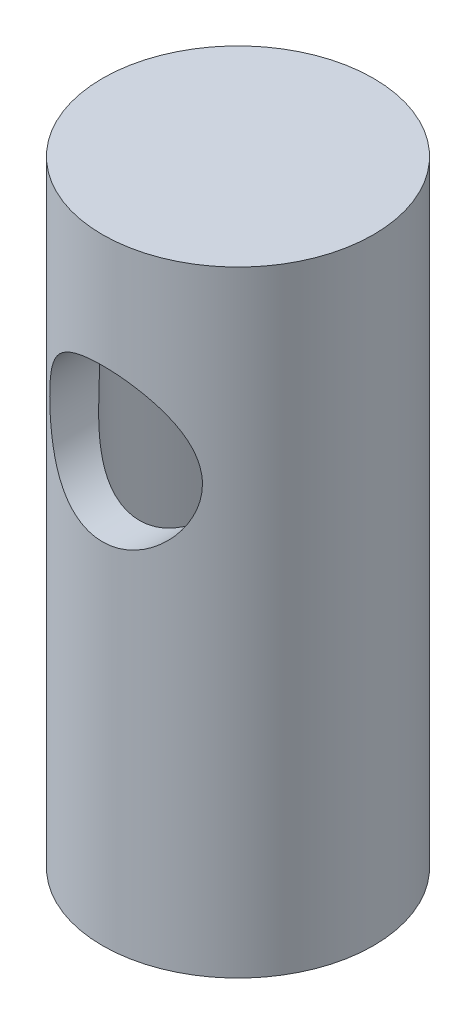
ISO-10303-21;
HEADER;
FILE_DESCRIPTION(('STEP AP214'),'2;1');
FILE_NAME('part.step','',(''),(''),'','','');
FILE_SCHEMA(('AUTOMOTIVE_DESIGN { 1 0 10303 214 1 1 1 1 }'));
ENDSEC;
DATA;
#1=APPLICATION_CONTEXT('core data for automotive mechanical design processes');
#2=APPLICATION_PROTOCOL_DEFINITION('international standard','automotive_design',2000,#1);
#3=PRODUCT_CONTEXT('',#1,'mechanical');
#4=PRODUCT('Part','Part','',(#3));
#5=PRODUCT_RELATED_PRODUCT_CATEGORY('part','',(#4));
#6=PRODUCT_DEFINITION_FORMATION('','',#4);
#7=PRODUCT_DEFINITION_CONTEXT('part definition',#1,'design');
#8=PRODUCT_DEFINITION('design','',#6,#7);
#9=PRODUCT_DEFINITION_SHAPE('','',#8);
#10=(LENGTH_UNIT() NAMED_UNIT(*) SI_UNIT(.MILLI.,.METRE.));
#11=(NAMED_UNIT(*) PLANE_ANGLE_UNIT() SI_UNIT($,.RADIAN.));
#12=(NAMED_UNIT(*) SI_UNIT($,.STERADIAN.) SOLID_ANGLE_UNIT());
#13=UNCERTAINTY_MEASURE_WITH_UNIT(LENGTH_MEASURE(1.E-05),#10,'distance_accuracy_value','');
#14=(GEOMETRIC_REPRESENTATION_CONTEXT(3) GLOBAL_UNCERTAINTY_ASSIGNED_CONTEXT((#13)) GLOBAL_UNIT_ASSIGNED_CONTEXT((#10,
#11,#12)) REPRESENTATION_CONTEXT('',''));
#15=CARTESIAN_POINT('',(0.,0.,0.));
#16=DIRECTION('',(0.,0.,1.));
#17=DIRECTION('',(1.,0.,0.));
#18=AXIS2_PLACEMENT_3D('',#15,#16,#17);
#19=CARTESIAN_POINT('',(3.53883589099269E-13,17.3000000000001,-5.5));
#20=DIRECTION('',(0.,0.,1.));
#21=DIRECTION('',(1.,0.,0.));
#22=AXIS2_PLACEMENT_3D('',#19,#20,#21);
#23=CYLINDRICAL_SURFACE('',#22,3.1);
#24=CARTESIAN_POINT('',(3.10000000000035,17.3000000000001,-2.52784493195277));
#25=CARTESIAN_POINT('',(3.09999961919371,17.3712555712001,-2.52784574093311));
#26=CARTESIAN_POINT('',(3.09753439791373,17.4425153113779,-2.53087865516682));
#27=CARTESIAN_POINT('',(3.08776425877487,17.5841936421896,-2.54278674023389));
#28=CARTESIAN_POINT('',(3.08045864827326,17.6546121109722,-2.55166274719215));
#29=CARTESIAN_POINT('',(3.05151757485534,17.8639778219894,-2.58634576054116));
#30=CARTESIAN_POINT('',(3.02285944185724,18.0006757075071,-2.62020347776882));
#31=CARTESIAN_POINT('',(2.94130207894668,18.2933519056116,-2.71167067274079));
#32=CARTESIAN_POINT('',(2.88447849264723,18.4470309211889,-2.77285031642847));
#33=CARTESIAN_POINT('',(2.75011335563942,18.739738251803,-2.90617907189162));
#34=CARTESIAN_POINT('',(2.67254674573882,18.8787485607272,-2.97834140587626));
#35=CARTESIAN_POINT('',(2.49592691468387,19.1457072154897,-3.12795783572872));
#36=CARTESIAN_POINT('',(2.3963536235693,19.273259321814,-3.2055019160276));
#37=CARTESIAN_POINT('',(2.17772837866821,19.5121646581724,-3.35786412946302));
#38=CARTESIAN_POINT('',(2.05869095152856,19.6235298527665,-3.4326842450413));
#39=CARTESIAN_POINT('',(1.80728422149956,19.8235610318894,-3.57119162579643));
#40=CARTESIAN_POINT('',(1.67573700604735,19.9130128953005,-3.635224841056));
#41=CARTESIAN_POINT('',(1.39643160562404,20.0723171931872,-3.75136978376732));
#42=CARTESIAN_POINT('',(1.24868898673577,20.1421882217937,-3.80349281248995));
#43=CARTESIAN_POINT('',(0.96323655310288,20.2498766896615,-3.88467854744163));
#44=CARTESIAN_POINT('',(0.827419124070257,20.2909531899676,-3.91604298335587));
#45=CARTESIAN_POINT('',(0.549029124361982,20.3543251551191,-3.9646543384196));
#46=CARTESIAN_POINT('',(0.406460979987843,20.3766327510472,-3.98191037617887));
#47=CARTESIAN_POINT('',(0.118129121638677,20.4011342698101,-4.00087142946686));
#48=CARTESIAN_POINT('',(-0.0276427199802487,20.4032691661889,-4.00253080821742));
#49=CARTESIAN_POINT('',(-0.317364296176167,20.387124210706,-3.99002636463383));
#50=CARTESIAN_POINT('',(-0.461313770984674,20.368841480834,-3.97586031159191));
#51=CARTESIAN_POINT('',(-0.73686754395094,20.3142826506517,-3.93390568713725));
#52=CARTESIAN_POINT('',(-0.868736309815778,20.2788356258629,-3.90674542775094));
#53=CARTESIAN_POINT('',(-1.12412799855287,20.1921516724821,-3.84106018790414));
#54=CARTESIAN_POINT('',(-1.247648970535,20.1409110683624,-3.8025325620863));
#55=CARTESIAN_POINT('',(-1.496908178085,20.0185490905798,-3.71195871888118));
#56=CARTESIAN_POINT('',(-1.62153590072253,19.9459123341516,-3.65892208872868));
#57=CARTESIAN_POINT('',(-1.85722616418577,19.7861646857189,-3.54511945328042));
#58=CARTESIAN_POINT('',(-1.968278877243,19.6990434139326,-3.48434791242756));
#59=CARTESIAN_POINT('',(-2.19738156573586,19.4931333063421,-3.34557701732754));
#60=CARTESIAN_POINT('',(-2.31227714037555,19.3715059872555,-3.26658445312791));
#61=CARTESIAN_POINT('',(-2.5211768027675,19.1114983960333,-3.10818793012157));
#62=CARTESIAN_POINT('',(-2.61516330503679,18.9731041721151,-3.02878368206824));
#63=CARTESIAN_POINT('',(-2.76762533135622,18.7036352058329,-2.88948574724767));
#64=CARTESIAN_POINT('',(-2.82938377606428,18.5749827723254,-2.82851128916844));
#65=CARTESIAN_POINT('',(-2.9357068780092,18.3061858130971,-2.71799479675345));
#66=CARTESIAN_POINT('',(-2.98030995883409,18.1660678317236,-2.66842731502265));
#67=CARTESIAN_POINT('',(-3.04130155928687,17.9109309347035,-2.59848268697316));
#68=CARTESIAN_POINT('',(-3.06191407444093,17.7980974841371,-2.5739379328752));
#69=CARTESIAN_POINT('',(-3.09048502463603,17.5687046365382,-2.53957213723589));
#70=CARTESIAN_POINT('',(-3.09846538450437,17.4521520541646,-2.52972558665546));
#71=CARTESIAN_POINT('',(-3.10113404168222,17.2183251079746,-2.52645548046137));
#72=CARTESIAN_POINT('',(-3.09578541203111,17.1010496388549,-2.53307754981358));
#73=CARTESIAN_POINT('',(-3.07219543043933,16.8696551460248,-2.56162678367886));
#74=CARTESIAN_POINT('',(-3.05393438623813,16.7555412204504,-2.58357732445827));
#75=CARTESIAN_POINT('',(-2.99796045084913,16.4968903867693,-2.64850587674715));
#76=CARTESIAN_POINT('',(-2.95586295343442,16.3544709692538,-2.69599177574273));
#77=CARTESIAN_POINT('',(-2.85402988216378,16.0810092521586,-2.80356685356465));
#78=CARTESIAN_POINT('',(-2.79424140331063,15.9500026258508,-2.86369367675896));
#79=CARTESIAN_POINT('',(-2.68074488498459,15.7402432217302,-2.96943572156276));
#80=CARTESIAN_POINT('',(-2.63132910245084,15.658298736066,-3.01345133300174));
#81=CARTESIAN_POINT('',(-2.52550207156438,15.4997407398975,-3.10268243369515));
#82=CARTESIAN_POINT('',(-2.46908839965332,15.4231290907197,-3.14789833435701));
#83=CARTESIAN_POINT('',(-2.28966790336391,15.2015404417918,-3.28325659106933));
#84=CARTESIAN_POINT('',(-2.15633898902273,15.0645477380677,-3.37324996195023));
#85=CARTESIAN_POINT('',(-1.88786210712003,14.835932955663,-3.52930091170506));
#86=CARTESIAN_POINT('',(-1.75675321128694,14.7405547302821,-3.59684370367943));
#87=CARTESIAN_POINT('',(-1.47724527932951,14.569714269087,-3.72034524430613));
#88=CARTESIAN_POINT('',(-1.32887419570484,14.4942204643073,-3.77632232411431));
#89=CARTESIAN_POINT('',(-1.0428294830555,14.3772740121066,-3.8640783637407));
#90=CARTESIAN_POINT('',(-0.907367136065546,14.3322752359359,-3.89831638948326));
#91=CARTESIAN_POINT('',(-0.628859216424906,14.2610610777622,-3.95279873177774));
#92=CARTESIAN_POINT('',(-0.485817837103067,14.2348354231416,-3.97305070125979));
#93=CARTESIAN_POINT('',(-0.195574842092821,14.2027215375749,-3.99787799003022));
#94=CARTESIAN_POINT('',(-0.0483603882720157,14.1969050009991,-4.00239804486007));
#95=CARTESIAN_POINT('',(0.244999864279834,14.2062140967541,-3.99518489730406));
#96=CARTESIAN_POINT('',(0.3911456308627,14.2213403565006,-3.98345120797965));
#97=CARTESIAN_POINT('',(0.669786686992614,14.2701012818615,-3.94589200602359));
#98=CARTESIAN_POINT('',(0.802588404312789,14.3026543907056,-3.92089064036331));
#99=CARTESIAN_POINT('',(1.06027503531116,14.3838238317389,-3.85919546547971));
#100=CARTESIAN_POINT('',(1.1851580770931,14.4324439452607,-3.82249890389134));
#101=CARTESIAN_POINT('',(1.43610658497467,14.5489154922742,-3.73588114945531));
#102=CARTESIAN_POINT('',(1.56122234819681,14.6181253824997,-3.68505345230524));
#103=CARTESIAN_POINT('',(1.79836128263859,14.7710015751779,-3.57533206525064));
#104=CARTESIAN_POINT('',(1.91037626028614,14.8546768444507,-3.51643337701191));
#105=CARTESIAN_POINT('',(2.14160046570904,15.0525364724897,-3.38154189124019));
#106=CARTESIAN_POINT('',(2.2578208459493,15.1694796537634,-3.30447720482253));
#107=CARTESIAN_POINT('',(2.47014450840322,15.4197419067186,-3.1489206275693));
#108=CARTESIAN_POINT('',(2.56622846239247,15.5530765189794,-3.07042744338394));
#109=CARTESIAN_POINT('',(2.72790479829606,15.8200857501056,-2.92726465663872));
#110=CARTESIAN_POINT('',(2.795684491068,15.952122688412,-2.86202272267527));
#111=CARTESIAN_POINT('',(2.91291319314547,16.2288046413986,-2.74261040904916));
#112=CARTESIAN_POINT('',(2.96239020668408,16.3734299726596,-2.68842317247582));
#113=CARTESIAN_POINT('',(3.03325535723146,16.6476321582904,-2.60802030600147));
#114=CARTESIAN_POINT('',(3.05807821971029,16.7752964952995,-2.57854049835101));
#115=CARTESIAN_POINT('',(3.08311910440419,16.9703242508766,-2.54843696280628));
#116=CARTESIAN_POINT('',(3.08943363954387,17.0358677357431,-2.54075566813512));
#117=CARTESIAN_POINT('',(3.09787331229765,17.1676064876364,-2.53046042834751));
#118=CARTESIAN_POINT('',(3.10000035378111,17.2338014447031,-2.52784418038586));
#119=CARTESIAN_POINT('',(3.10000000000035,17.3000000000001,-2.52784493195277));
#120=B_SPLINE_CURVE_WITH_KNOTS('',3,(#24,#25,#26,#27,#28,#29,#30,#31,#32,#33,#34,#35,#36,#37,
#38,#39,#40,#41,#42,#43,#44,#45,#46,#47,#48,#49,#50,#51,#52,#53,#54,#55,#56,#57,#58,#59,#60,#61,
#62,#63,#64,#65,#66,#67,#68,#69,#70,#71,#72,#73,#74,#75,#76,#77,#78,#79,#80,#81,#82,#83,#84,#85,
#86,#87,#88,#89,#90,#91,#92,#93,#94,#95,#96,#97,#98,#99,#100,#101,#102,#103,#104,#105,#106,#107,
#108,#109,#110,#111,#112,#113,#114,#115,#116,#117,#118,#119),.UNSPECIFIED.,.T.,.F.,(4,2,2,2,2,2,
2,2,2,2,2,2,2,2,2,2,2,2,2,2,2,2,2,2,2,2,2,2,2,2,2,2,2,2,2,2,2,2,2,2,2,2,2,2,2,2,2,4),(0.,
0.21366508663548,0.427360754600619,0.855809914955401,1.37772471555355,1.90027290084145,
2.43682357490332,2.97297561829987,3.48542384746284,3.9973837895288,4.43146821760399,
4.86527186379727,5.30034445222658,5.73547837498644,6.15142263765094,6.56746377325984,
7.02686356687362,7.48659400234934,8.03963129362027,8.59313197065748,9.05731973209165,
9.52046169300837,9.87094487688248,10.2208190797803,10.571663659771,10.9230444574905,
11.3882347864584,11.8548305776667,12.1704500007607,12.4861790381846,13.1166595534028,
13.6416204586391,14.1657428304335,14.6042540779241,15.0425251890581,15.4823343522429,
15.9221566917562,16.3374001437266,16.7527413919709,17.2063221476341,17.6601850844362,
18.2041795460807,18.7486938005938,19.233551780756,19.7176647992549,20.1154884025408,
20.3140799656732,20.5125812170768),.UNSPECIFIED.);
#121=CARTESIAN_POINT('',(3.10000000000035,17.3000000000001,-2.52784493195277));
#122=VERTEX_POINT('',#121);
#123=EDGE_CURVE('E36',#122,#122,#120,.T.);
#124=ORIENTED_EDGE('',*,*,#123,.T.);
#125=EDGE_LOOP('',(#124));
#126=FACE_BOUND('',#125,.T.);
#127=CARTESIAN_POINT('',(2.88652296454992E-13,20.4000000000001,-5.5));
#128=CARTESIAN_POINT('',(-0.080262632435428,20.3999998034787,-5.49999990682888));
#129=CARTESIAN_POINT('',(-0.160521827303716,20.3968773730526,-5.49823772074624));
#130=CARTESIAN_POINT('',(-0.320415396259867,20.3844412076063,-5.49124358635375));
#131=CARTESIAN_POINT('',(-0.400049542149584,20.3751253089282,-5.48601042547741));
#132=CARTESIAN_POINT('',(-0.637021736450279,20.338039973795,-5.46527467257751));
#133=CARTESIAN_POINT('',(-0.792605200536478,20.3011325569167,-5.44473540973389));
#134=CARTESIAN_POINT('',(-1.09381878140616,20.2049155626083,-5.39230312589284));
#135=CARTESIAN_POINT('',(-1.23948334567826,20.1456887348582,-5.36045206842486));
#136=CARTESIAN_POINT('',(-1.51854595874315,20.0070830378088,-5.28817574751319));
#137=CARTESIAN_POINT('',(-1.65194095708642,19.927699175433,-5.24774836004519));
#138=CARTESIAN_POINT('',(-1.91323389681138,19.7447410046295,-5.15848143213593));
#139=CARTESIAN_POINT('',(-2.0400738770545,19.6398518777834,-5.10924894725752));
#140=CARTESIAN_POINT('',(-2.27538176991611,19.4117593603085,-5.0088952804327));
#141=CARTESIAN_POINT('',(-2.38383020956816,19.2885368141301,-4.95777216556694));
#142=CARTESIAN_POINT('',(-2.59078954450882,19.0119303210229,-4.8531039174898));
#143=CARTESIAN_POINT('',(-2.68705917147908,18.8567376703794,-4.79986865939255));
#144=CARTESIAN_POINT('',(-2.85172159074769,18.5292824284682,-4.70391519171295));
#145=CARTESIAN_POINT('',(-2.92015536842132,18.3570454015948,-4.66118155658493));
#146=CARTESIAN_POINT('',(-3.01429495596228,18.0384792613907,-4.60070147472893));
#147=CARTESIAN_POINT('',(-3.04603434612334,17.894579580445,-4.57955297142091));
#148=CARTESIAN_POINT('',(-3.08872992519048,17.6024529917743,-4.55087238950658));
#149=CARTESIAN_POINT('',(-3.09970747390032,17.4542306908056,-4.54332631708091));
#150=CARTESIAN_POINT('',(-3.10028134149946,17.1575478349604,-4.54293466795083));
#151=CARTESIAN_POINT('',(-3.08985140969875,17.0090872108958,-4.55010713969886));
#152=CARTESIAN_POINT('',(-3.04816644059781,16.7164204176829,-4.57813129027249));
#153=CARTESIAN_POINT('',(-3.0168974760292,16.5722171611975,-4.59899211723864));
#154=CARTESIAN_POINT('',(-2.9351230915428,16.291853361302,-4.65159982495658));
#155=CARTESIAN_POINT('',(-2.88465198821505,16.1556789678525,-4.68332727567779));
#156=CARTESIAN_POINT('',(-2.7662123612813,15.893295331572,-4.75424296851555));
#157=CARTESIAN_POINT('',(-2.698237065914,15.7670899701592,-4.79343409653686));
#158=CARTESIAN_POINT('',(-2.5344290129505,15.5072975700171,-4.8822767461787));
#159=CARTESIAN_POINT('',(-2.43590346585574,15.3756364614153,-4.932605993681));
#160=CARTESIAN_POINT('',(-2.21942873879718,15.1295030836141,-5.03373145578233));
#161=CARTESIAN_POINT('',(-2.10146360117291,15.01504508502,-5.08452802137829));
#162=CARTESIAN_POINT('',(-1.83406444952499,14.7941393102647,-5.18736625820771));
#163=CARTESIAN_POINT('',(-1.6826101066626,14.6898788685097,-5.23895371306015));
#164=CARTESIAN_POINT('',(-1.44174396026146,14.5541116352799,-5.3083341441316));
#165=CARTESIAN_POINT('',(-1.35913990066216,14.5122809542548,-5.33013437260469));
#166=CARTESIAN_POINT('',(-1.18986622824611,14.4359434155516,-5.37045289077485));
#167=CARTESIAN_POINT('',(-1.10319909932609,14.401432152745,-5.38897315337744));
#168=CARTESIAN_POINT('',(-0.932600976232554,14.3423267396445,-5.42100170609961));
#169=CARTESIAN_POINT('',(-0.848899436621294,14.3172095034572,-5.43476913006937));
#170=CARTESIAN_POINT('',(-0.679211488312519,14.2740571021679,-5.45857181773591));
#171=CARTESIAN_POINT('',(-0.593226323997034,14.2560181612317,-5.46860907109721));
#172=CARTESIAN_POINT('',(-0.419704312495956,14.2272857095422,-5.48465398386025));
#173=CARTESIAN_POINT('',(-0.332168314901613,14.2165882971951,-5.49066378357844));
#174=CARTESIAN_POINT('',(-0.156347163600282,14.2026874228815,-5.49848325444056));
#175=CARTESIAN_POINT('',(-0.0680620895912214,14.1994831734709,-5.50029336692262));
#176=CARTESIAN_POINT('',(0.175928060097594,14.201093805688,-5.49937985147266));
#177=CARTESIAN_POINT('',(0.331659711817021,14.2138961603828,-5.49214123186689));
#178=CARTESIAN_POINT('',(0.63824952929562,14.2624385918044,-5.46501515421518));
#179=CARTESIAN_POINT('',(0.789107572799959,14.2981792434716,-5.4451273791227));
#180=CARTESIAN_POINT('',(1.08114017053372,14.390630142066,-5.39471461029263));
#181=CARTESIAN_POINT('',(1.22237446771205,14.4471936886896,-5.36426411705396));
#182=CARTESIAN_POINT('',(1.49346730471244,14.5792792877741,-5.29520132389016));
#183=CARTESIAN_POINT('',(1.62332294558735,14.6548061526961,-5.25658695255108));
#184=CARTESIAN_POINT('',(1.88246985328245,14.8315203544449,-5.16980249283242));
#185=CARTESIAN_POINT('',(2.01030612442888,14.9345565052675,-5.12105672116788));
#186=CARTESIAN_POINT('',(2.2478639680082,15.1590050404423,-5.02132897326842));
#187=CARTESIAN_POINT('',(2.35756487392118,15.2804380915708,-4.97034452847567));
#188=CARTESIAN_POINT('',(2.56757299774256,15.5534870353436,-4.8654652395043));
#189=CARTESIAN_POINT('',(2.66564418552922,15.706938926699,-4.81183661820226));
#190=CARTESIAN_POINT('',(2.83428142482542,16.0311004590915,-4.71448576417716));
#191=CARTESIAN_POINT('',(2.90488533883148,16.2017859323553,-4.67074992974113));
#192=CARTESIAN_POINT('',(3.00351598346206,16.5187655504823,-4.60777247291853));
#193=CARTESIAN_POINT('',(3.03738517143019,16.662599606785,-4.58530877697894));
#194=CARTESIAN_POINT('',(3.08429068245404,16.9550130731767,-4.55389713336623));
#195=CARTESIAN_POINT('',(3.0973492849571,17.1035872344751,-4.54493473200764));
#196=CARTESIAN_POINT('',(3.10192368161733,17.4014667287282,-4.54181467010182));
#197=CARTESIAN_POINT('',(3.09340459014177,17.5507728557069,-4.54768098377736));
#198=CARTESIAN_POINT('',(3.05525554330078,17.8454548743735,-4.57339233744031));
#199=CARTESIAN_POINT('',(3.02561210478809,17.9908281943044,-4.5932463053089));
#200=CARTESIAN_POINT('',(2.94709512855162,18.2725328568242,-4.64400270000587));
#201=CARTESIAN_POINT('',(2.89841746958498,18.4089402715389,-4.67479230266338));
#202=CARTESIAN_POINT('',(2.78355347956239,18.6720285217997,-4.7440826908267));
#203=CARTESIAN_POINT('',(2.71736052526532,18.7987056545033,-4.78258639200454));
#204=CARTESIAN_POINT('',(2.55765542540611,19.0593113043355,-4.87010060140478));
#205=CARTESIAN_POINT('',(2.46151538127792,19.1913946744297,-4.91981775017526));
#206=CARTESIAN_POINT('',(2.2499308136955,19.4387758967196,-5.02011559144432));
#207=CARTESIAN_POINT('',(2.13447052188678,19.5540598930243,-5.0706969587548));
#208=CARTESIAN_POINT('',(1.87160840187957,19.7779228975089,-5.17388909709983));
#209=CARTESIAN_POINT('',(1.72206441806096,19.8842313755542,-5.22607157916784));
#210=CARTESIAN_POINT('',(1.48384027438088,20.023363496186,-5.29670966190677));
#211=CARTESIAN_POINT('',(1.40207381345455,20.0663673743287,-5.31899148308538));
#212=CARTESIAN_POINT('',(1.2343816605573,20.1451477999685,-5.36038595935004));
#213=CARTESIAN_POINT('',(1.14845842867598,20.1809285589776,-5.37950046000233));
#214=CARTESIAN_POINT('',(0.976846638988448,20.243424982439,-5.41323286920666));
#215=CARTESIAN_POINT('',(0.891306916119945,20.2704643324104,-5.42800880998231));
#216=CARTESIAN_POINT('',(0.717697121711355,20.3171149791092,-5.4536779164714));
#217=CARTESIAN_POINT('',(0.629628447632383,20.3367302963907,-5.46457318361087));
#218=CARTESIAN_POINT('',(0.451753275287401,20.3682360080363,-5.48214384002671));
#219=CARTESIAN_POINT('',(0.36194778423594,20.3801307491072,-5.48882160371252));
#220=CARTESIAN_POINT('',(0.181426661220242,20.3960124011359,-5.49774948158858));
#221=CARTESIAN_POINT('',(0.090711135200282,20.4000002221045,-5.50000010530004));
#222=CARTESIAN_POINT('',(2.88652296454992E-13,20.4000000000001,-5.5));
#223=B_SPLINE_CURVE_WITH_KNOTS('',3,(#127,#128,#129,#130,#131,#132,#133,#134,#135,#136,#137,
#138,#139,#140,#141,#142,#143,#144,#145,#146,#147,#148,#149,#150,#151,#152,#153,#154,#155,#156,
#157,#158,#159,#160,#161,#162,#163,#164,#165,#166,#167,#168,#169,#170,#171,#172,#173,#174,#175,
#176,#177,#178,#179,#180,#181,#182,#183,#184,#185,#186,#187,#188,#189,#190,#191,#192,#193,#194,
#195,#196,#197,#198,#199,#200,#201,#202,#203,#204,#205,#206,#207,#208,#209,#210,#211,#212,#213,
#214,#215,#216,#217,#218,#219,#220,#221,#222),.UNSPECIFIED.,.T.,.F.,(4,2,2,2,2,2,2,2,2,2,2,2,2,
2,2,2,2,2,2,2,2,2,2,2,2,2,2,2,2,2,2,2,2,2,2,2,2,2,2,2,2,2,2,2,2,2,2,4),(0.,0.240693410580825,
0.481470950437682,0.962506390880611,1.44177565371943,1.92116375182539,2.43449465823084,
2.94836573132791,3.51622753851728,4.083250175343,4.52791701052589,4.97212612263576,
5.41688026675238,5.86193195012721,6.3061919791514,6.75062413576726,7.26447290854134,
7.77874561248342,8.34835826956386,8.63338498991007,8.91823967952569,9.1832666474881,
9.44815204707619,9.71289656630524,9.97761326271437,10.4443797757061,10.911157988494,
11.3747087227925,11.8383772148879,12.3501288509602,12.8624597028089,13.4292183507703,
13.9951929535754,14.4416570183843,14.887642784729,15.3343500565033,15.7813427061333,
16.2238515977321,16.6665280595469,17.1767824285438,17.6874552947599,18.2564675295794,
18.5412329750836,18.8258319026121,19.0981909337338,19.3704022545111,19.6424601862873,
19.914486804981),.UNSPECIFIED.);
#224=CARTESIAN_POINT('',(2.88652296454992E-13,20.4000000000001,-5.5));
#225=VERTEX_POINT('',#224);
#226=EDGE_CURVE('E10',#225,#225,#223,.T.);
#227=ORIENTED_EDGE('',*,*,#226,.F.);
#228=EDGE_LOOP('',(#227));
#229=FACE_BOUND('',#228,.T.);
#230=ADVANCED_FACE('F31',(#126,#229),#23,.F.);
#231=CARTESIAN_POINT('',(3.53740559381116E-13,25.,0.));
#232=DIRECTION('',(0.,1.,0.));
#233=DIRECTION('',(-1.,0.,0.));
#234=AXIS2_PLACEMENT_3D('',#231,#232,#233);
#235=CYLINDRICAL_SURFACE('',#234,5.5);
#236=ORIENTED_EDGE('',*,*,#226,.T.);
#237=EDGE_LOOP('',(#236));
#238=FACE_BOUND('',#237,.T.);
#239=CARTESIAN_POINT('',(3.10000000000035,17.3000000000001,4.54312667664014));
#240=CARTESIAN_POINT('',(3.09999476387845,17.1418193924679,4.5431344778618));
#241=CARTESIAN_POINT('',(3.08781678516506,16.9835996519711,4.55151279150236));
#242=CARTESIAN_POINT('',(3.0398852718734,16.6723306285086,4.58365373088068));
#243=CARTESIAN_POINT('',(3.00410566707723,16.5192872600821,4.60743336830277));
#244=CARTESIAN_POINT('',(2.91117887019317,16.2234541513712,4.66669243570402));
#245=CARTESIAN_POINT('',(2.85416664768092,16.080606294795,4.70209779960603));
#246=CARTESIAN_POINT('',(2.72082211111754,15.8065537987885,4.78049152677357));
#247=CARTESIAN_POINT('',(2.6444837152712,15.6753528421334,4.82348227580727));
#248=CARTESIAN_POINT('',(2.46514485946905,15.4129592061398,4.91775971893991));
#249=CARTESIAN_POINT('',(2.3601703300312,15.2832566215728,4.96944228544603));
#250=CARTESIAN_POINT('',(2.13064719045021,15.0421021009573,5.07209933305238));
#251=CARTESIAN_POINT('',(2.00608641122967,14.9306615997688,5.12307335235322));
#252=CARTESIAN_POINT('',(1.72689903393567,14.719082126047,5.22414697096568));
#253=CARTESIAN_POINT('',(1.57056419189854,14.6209105803946,5.27373968762059));
#254=CARTESIAN_POINT('',(1.32308778818647,14.4949969097191,5.33917406846357));
#255=CARTESIAN_POINT('',(1.23840287114968,14.4565737053144,5.3594983656258));
#256=CARTESIAN_POINT('',(1.06526211225267,14.3872880348663,5.39657562418754));
#257=CARTESIAN_POINT('',(0.976808654898649,14.356420868839,5.41333080479168));
#258=CARTESIAN_POINT('',(0.804591506799089,14.3050037190439,5.44146877024413));
#259=CARTESIAN_POINT('',(0.721079079319646,14.2837945697542,5.45318975002423));
#260=CARTESIAN_POINT('',(0.552189999844556,14.2483568942569,5.47287019197846));
#261=CARTESIAN_POINT('',(0.466814361804734,14.2341246655182,5.48083164918372));
#262=CARTESIAN_POINT('',(0.294925528505813,14.2128474337706,5.4927617620303));
#263=CARTESIAN_POINT('',(0.208412841101899,14.2057993255908,5.49673214271252));
#264=CARTESIAN_POINT('',(0.0350387831909354,14.1989822517507,5.50057349564704));
#265=CARTESIAN_POINT('',(-0.0518225571083111,14.1992126685221,5.50044481569646));
#266=CARTESIAN_POINT('',(-0.292675684298827,14.2100018827145,5.49436236552712));
#267=CARTESIAN_POINT('',(-0.446293475704265,14.2284604579389,5.48395243869228));
#268=CARTESIAN_POINT('',(-0.747725397980008,14.2876001161515,5.45105185675593));
#269=CARTESIAN_POINT('',(-0.895539101984052,14.3282828303629,5.42856031488149));
#270=CARTESIAN_POINT('',(-1.18326709659643,14.43060709558,5.37322503549918));
#271=CARTESIAN_POINT('',(-1.32309183543648,14.4924462803895,5.34028390207808));
#272=CARTESIAN_POINT('',(-1.59062070925674,14.6348688916787,5.2668023722629));
#273=CARTESIAN_POINT('',(-1.71832114526995,14.7154580128101,5.22625966787936));
#274=CARTESIAN_POINT('',(-1.97318158383294,14.9032684497994,5.13583511060551));
#275=CARTESIAN_POINT('',(-2.09870291807084,15.0124545952785,5.08541607836273));
#276=CARTESIAN_POINT('',(-2.33064869015163,15.2492456906908,4.98338943202789));
#277=CARTESIAN_POINT('',(-2.43705047214924,15.3768721728963,4.93178048855106));
#278=CARTESIAN_POINT('',(-2.63788980080037,15.6614943490272,4.8275783360639));
#279=CARTESIAN_POINT('',(-2.7302190538102,15.8201300871652,4.77536052452919));
#280=CARTESIAN_POINT('',(-2.88625452814572,16.1539938775557,4.682716671581));
#281=CARTESIAN_POINT('',(-2.95001062530973,16.3291923660561,4.64227012647294));
#282=CARTESIAN_POINT('',(-3.03474730147883,16.6508030627694,4.58718453373852));
#283=CARTESIAN_POINT('',(-3.06210376812141,16.7948963361805,4.56879773323499));
#284=CARTESIAN_POINT('',(-3.09611597030652,17.086542785047,4.54582401427734));
#285=CARTESIAN_POINT('',(-3.10279051511286,17.2340926937038,4.54122455698815));
#286=CARTESIAN_POINT('',(-3.09507921772198,17.5284212661922,4.54648201664504));
#287=CARTESIAN_POINT('',(-3.08068467759965,17.6751995863811,4.55634490406662));
#288=CARTESIAN_POINT('',(-3.03162920441915,17.9638475978988,4.58912495643054));
#289=CARTESIAN_POINT('',(-2.99695388042078,18.1057137278209,4.6120513907719));
#290=CARTESIAN_POINT('',(-2.90821557800299,18.383460528679,4.66851828300326));
#291=CARTESIAN_POINT('',(-2.8538577538243,18.5192128255553,4.70221919284245));
#292=CARTESIAN_POINT('',(-2.72762990286966,18.7802307397277,4.77654631489554));
#293=CARTESIAN_POINT('',(-2.6557525937155,18.9054919670012,4.81717540485225));
#294=CARTESIAN_POINT('',(-2.48302231752153,19.1634460560449,4.90872810299442));
#295=CARTESIAN_POINT('',(-2.37936093913407,19.2940513814432,4.96025279751826));
#296=CARTESIAN_POINT('',(-2.15237771646414,19.5371830524111,5.06288767124416));
#297=CARTESIAN_POINT('',(-2.02904038537419,19.6496950155673,5.11399749032051));
#298=CARTESIAN_POINT('',(-1.75218308748031,19.863814000691,5.2156926869425));
#299=CARTESIAN_POINT('',(-1.59692673578879,19.9634505126523,5.26579252133954));
#300=CARTESIAN_POINT('',(-1.35089203081866,20.0917164376087,5.33220081502601));
#301=CARTESIAN_POINT('',(-1.26665928411728,20.1309495647373,5.3528852974329));
#302=CARTESIAN_POINT('',(-1.09435004463438,20.2019061783367,5.3907470016926));
#303=CARTESIAN_POINT('',(-1.00627596569996,20.233634302577,5.40792638863679));
#304=CARTESIAN_POINT('',(-0.834375742313322,20.2868437492835,5.43698284825034));
#305=CARTESIAN_POINT('',(-0.750797734584299,20.3089540623312,5.44918022732636));
#306=CARTESIAN_POINT('',(-0.581680360643873,20.3461679124424,5.46981707690896));
#307=CARTESIAN_POINT('',(-0.496142062065164,20.3612751726765,5.47825854414867));
#308=CARTESIAN_POINT('',(-0.323832398565957,20.3842632001691,5.49113715028852));
#309=CARTESIAN_POINT('',(-0.237061602169019,20.392147196037,5.4955760782046));
#310=CARTESIAN_POINT('',(-0.0630805786239102,20.4005835965118,5.50032837154222));
#311=CARTESIAN_POINT('',(0.0241296084510328,20.4011366580243,5.50064210661136));
#312=CARTESIAN_POINT('',(0.26572374461563,20.3924470629494,5.49574101163262));
#313=CARTESIAN_POINT('',(0.419825422772415,20.3752866063187,5.48605653036713));
#314=CARTESIAN_POINT('',(0.722435210684888,20.3185824973489,5.45447547934389));
#315=CARTESIAN_POINT('',(0.870942979337271,20.2790374824016,5.43257816615944));
#316=CARTESIAN_POINT('',(1.15965500575236,20.1790059279245,5.37837334427017));
#317=CARTESIAN_POINT('',(1.29980612452549,20.1183992929346,5.34600621045505));
#318=CARTESIAN_POINT('',(1.56816150422433,19.9783962916049,5.27353999943998));
#319=CARTESIAN_POINT('',(1.6963622880222,19.898994480167,5.23343868221606));
#320=CARTESIAN_POINT('',(1.95224052624541,19.7137859141174,5.14383908029104));
#321=CARTESIAN_POINT('',(2.0783212980953,19.6060391671157,5.09379260503691));
#322=CARTESIAN_POINT('',(2.31162244613235,19.3721332828324,4.99225686938309));
#323=CARTESIAN_POINT('',(2.41882004559438,19.2459522411799,4.94076595228332));
#324=CARTESIAN_POINT('',(2.6218843838825,18.9639736124127,4.83632002827278));
#325=CARTESIAN_POINT('',(2.71560361102843,18.8064843121907,4.78371807786899));
#326=CARTESIAN_POINT('',(2.87465029752777,18.4747582602294,4.68988002256491));
#327=CARTESIAN_POINT('',(2.94003071841813,18.3005534985428,4.64862276914721));
#328=CARTESIAN_POINT('',(3.02577997977063,17.9881025104301,4.5930951490673));
#329=CARTESIAN_POINT('',(3.05349543534975,17.8526150831366,4.57456566981788));
#330=CARTESIAN_POINT('',(3.0906011928916,17.5780934459832,4.5495823233578));
#331=CARTESIAN_POINT('',(3.10000460324969,17.439061845445,4.54311981832611));
#332=CARTESIAN_POINT('',(3.10000000000035,17.3000000000001,4.54312667664014));
#333=B_SPLINE_CURVE_WITH_KNOTS('',3,(#239,#240,#241,#242,#243,#244,#245,#246,#247,#248,#249,
#250,#251,#252,#253,#254,#255,#256,#257,#258,#259,#260,#261,#262,#263,#264,#265,#266,#267,#268,
#269,#270,#271,#272,#273,#274,#275,#276,#277,#278,#279,#280,#281,#282,#283,#284,#285,#286,#287,
#288,#289,#290,#291,#292,#293,#294,#295,#296,#297,#298,#299,#300,#301,#302,#303,#304,#305,#306,
#307,#308,#309,#310,#311,#312,#313,#314,#315,#316,#317,#318,#319,#320,#321,#322,#323,#324,#325,
#326,#327,#328,#329,#330,#331,#332),.UNSPECIFIED.,.T.,.F.,(4,2,2,2,2,2,2,2,2,2,2,2,2,2,2,2,2,2,
2,2,2,2,2,2,2,2,2,2,2,2,2,2,2,2,2,2,2,2,2,2,2,2,2,2,2,2,4),(0.,0.473961133785246,
0.948446680916586,1.41996616018004,1.89163420777343,2.41355344554665,2.93579824618494,
3.5058338713554,3.79104208741409,4.07607244575533,4.33657986622477,4.59694888984274,
4.85720532714753,5.11743968227211,5.58023464739818,6.04306358564273,6.51033977130248,
6.97775806180695,7.49714519074205,8.01714376982956,8.58672645377449,9.15531099353615,
9.59680414954071,10.0378956696503,10.4791693364112,10.9207565048894,11.3692526242297,
11.8179354902182,12.3393605172977,12.8611979979363,13.431291007248,13.7165227643012,
14.0015777971963,14.2631397240355,14.5245624316278,14.7858682330472,15.0471506193863,
15.5107781192807,15.9744338444623,16.4407779785853,16.9072573816768,17.4248524534898,
17.9430676317362,18.512188964475,19.0802420488867,19.4972156763528,19.9138907097948),.UNSPECIFIED.);
#334=CARTESIAN_POINT('',(3.10000000000035,17.3000000000001,4.54312667664014));
#335=VERTEX_POINT('',#334);
#336=EDGE_CURVE('E44',#335,#335,#333,.T.);
#337=ORIENTED_EDGE('',*,*,#336,.T.);
#338=EDGE_LOOP('',(#337));
#339=FACE_BOUND('',#338,.T.);
#340=CARTESIAN_POINT('',(3.53740559381116E-13,25.,0.));
#341=DIRECTION('',(0.,1.,0.));
#342=DIRECTION('',(-1.,0.,0.));
#343=AXIS2_PLACEMENT_3D('',#340,#341,#342);
#344=CIRCLE('',#343,5.5);
#345=CARTESIAN_POINT('',(-5.49999999999965,25.0000000000001,0.));
#346=VERTEX_POINT('',#345);
#347=EDGE_CURVE('E49',#346,#346,#344,.T.);
#348=ORIENTED_EDGE('',*,*,#347,.F.);
#349=EDGE_LOOP('',(#348));
#350=FACE_BOUND('',#349,.T.);
#351=CARTESIAN_POINT('',(0.,0.,0.));
#352=DIRECTION('',(0.,1.,0.));
#353=DIRECTION('',(-1.,0.,0.));
#354=AXIS2_PLACEMENT_3D('',#351,#352,#353);
#355=CIRCLE('',#354,5.5);
#356=CARTESIAN_POINT('',(-5.5,0.,0.));
#357=VERTEX_POINT('',#356);
#358=EDGE_CURVE('E88',#357,#357,#355,.T.);
#359=ORIENTED_EDGE('',*,*,#358,.T.);
#360=EDGE_LOOP('',(#359));
#361=FACE_BOUND('',#360,.T.);
#362=ADVANCED_FACE('F33',(#238,#339,#350,#361),#235,.T.);
#363=CARTESIAN_POINT('',(5.50000000000035,24.9999999999999,0.));
#364=DIRECTION('',(0.,-1.,0.));
#365=DIRECTION('',(1.,0.,0.));
#366=AXIS2_PLACEMENT_3D('',#363,#364,#365);
#367=PLANE('',#366);
#368=ORIENTED_EDGE('',*,*,#347,.T.);
#369=EDGE_LOOP('',(#368));
#370=FACE_BOUND('',#369,.T.);
#371=ADVANCED_FACE('F72',(#370),#367,.F.);
#372=CARTESIAN_POINT('',(0.,0.,0.));
#373=DIRECTION('',(0.,1.,0.));
#374=DIRECTION('',(-1.,0.,0.));
#375=AXIS2_PLACEMENT_3D('',#372,#373,#374);
#376=PLANE('',#375);
#377=CARTESIAN_POINT('',(0.,0.,0.));
#378=DIRECTION('',(0.,-1.,0.));
#379=DIRECTION('',(1.,0.,0.));
#380=AXIS2_PLACEMENT_3D('',#377,#378,#379);
#381=CIRCLE('',#380,4.);
#382=CARTESIAN_POINT('',(4.,0.,0.));
#383=VERTEX_POINT('',#382);
#384=EDGE_CURVE('E95',#383,#383,#381,.T.);
#385=ORIENTED_EDGE('',*,*,#384,.F.);
#386=EDGE_LOOP('',(#385));
#387=FACE_BOUND('',#386,.T.);
#388=ORIENTED_EDGE('',*,*,#358,.F.);
#389=EDGE_LOOP('',(#388));
#390=FACE_BOUND('',#389,.T.);
#391=ADVANCED_FACE('F64',(#387,#390),#376,.F.);
#392=CARTESIAN_POINT('',(3.10000000000035,17.3000000000001,2.52784493195277));
#393=CARTESIAN_POINT('',(3.09999961919371,17.2287444288001,2.5278457409331));
#394=CARTESIAN_POINT('',(3.09753439791373,17.1574846886223,2.53087865516682));
#395=CARTESIAN_POINT('',(3.08776425877487,17.0158063578105,2.54278674023388));
#396=CARTESIAN_POINT('',(3.08045864827326,16.9453878890279,2.55166274719213));
#397=CARTESIAN_POINT('',(3.05151757485534,16.7360221780107,2.58634576054114));
#398=CARTESIAN_POINT('',(3.02285944185725,16.5993242924931,2.62020347776879));
#399=CARTESIAN_POINT('',(2.94130207894669,16.3066480943886,2.71167067274075));
#400=CARTESIAN_POINT('',(2.88447849264724,16.1529690788113,2.77285031642843));
#401=CARTESIAN_POINT('',(2.75011335563944,15.8602617481972,2.90617907189156));
#402=CARTESIAN_POINT('',(2.67254674573885,15.721251439273,2.9783414058762));
#403=CARTESIAN_POINT('',(2.49592691468391,15.4542927845105,3.12795783572864));
#404=CARTESIAN_POINT('',(2.39635362356936,15.3267406781863,3.20550191602752));
#405=CARTESIAN_POINT('',(2.17772837866828,15.0878353418278,3.35786412946294));
#406=CARTESIAN_POINT('',(2.05869095152865,14.9764701472337,3.43268424504121));
#407=CARTESIAN_POINT('',(1.80728422149965,14.7764389681109,3.57119162579635));
#408=CARTESIAN_POINT('',(1.67573700604744,14.6869871046997,3.63522484105593));
#409=CARTESIAN_POINT('',(1.39643160562413,14.527682806813,3.75136978376726));
#410=CARTESIAN_POINT('',(1.24868898673585,14.4578117782065,3.8034928124899));
#411=CARTESIAN_POINT('',(0.963236553102959,14.3501233103387,3.88467854744159));
#412=CARTESIAN_POINT('',(0.827419124070335,14.3090468100326,3.91604298335583));
#413=CARTESIAN_POINT('',(0.549029124362058,14.2456748448811,3.96465433841957));
#414=CARTESIAN_POINT('',(0.406460979987918,14.223367248953,3.98191037617886));
#415=CARTESIAN_POINT('',(0.118129121638748,14.1988657301901,4.00087142946685));
#416=CARTESIAN_POINT('',(-0.0276427199801812,14.1967308338112,4.00253080821742));
#417=CARTESIAN_POINT('',(-0.317364296176105,14.2128757892942,3.99002636463384));
#418=CARTESIAN_POINT('',(-0.461313770984617,14.2311585191662,3.97586031159193));
#419=CARTESIAN_POINT('',(-0.736867543950887,14.2857173493484,3.93390568713728));
#420=CARTESIAN_POINT('',(-0.868736309815725,14.3211643741373,3.90674542775097));
#421=CARTESIAN_POINT('',(-1.12412799855282,14.407848327518,3.84106018790418));
#422=CARTESIAN_POINT('',(-1.24764897053495,14.4590889316377,3.80253256208635));
#423=CARTESIAN_POINT('',(-1.49690817808495,14.5814509094203,3.71195871888123));
#424=CARTESIAN_POINT('',(-1.62153590072248,14.6540876658485,3.65892208872874));
#425=CARTESIAN_POINT('',(-1.85722616418572,14.8138353142812,3.54511945328048));
#426=CARTESIAN_POINT('',(-1.96827887724295,14.9009565860675,3.48434791242762));
#427=CARTESIAN_POINT('',(-2.19738156573581,15.106866693658,3.34557701732762));
#428=CARTESIAN_POINT('',(-2.3122771403755,15.2284940127446,3.26658445312799));
#429=CARTESIAN_POINT('',(-2.52117680276745,15.4885016039668,3.10818793012166));
#430=CARTESIAN_POINT('',(-2.61516330503674,15.626895827885,3.02878368206832));
#431=CARTESIAN_POINT('',(-2.76762533135618,15.8963647941671,2.88948574724775));
#432=CARTESIAN_POINT('',(-2.82938377606424,16.0250172276746,2.82851128916851));
#433=CARTESIAN_POINT('',(-2.93570687800918,16.293814186903,2.71799479675351));
#434=CARTESIAN_POINT('',(-2.98030995883408,16.4339321682765,2.66842731502269));
#435=CARTESIAN_POINT('',(-3.04130155928686,16.6890690652966,2.59848268697319));
#436=CARTESIAN_POINT('',(-3.06191407444093,16.801902515863,2.57393793287522));
#437=CARTESIAN_POINT('',(-3.09048502463603,17.0312953634619,2.5395721372359));
#438=CARTESIAN_POINT('',(-3.09846538450437,17.1478479458355,2.52972558665547));
#439=CARTESIAN_POINT('',(-3.10113404168223,17.3816748920255,2.52645548046137));
#440=CARTESIAN_POINT('',(-3.09578541203111,17.4989503611452,2.53307754981357));
#441=CARTESIAN_POINT('',(-3.07219543043933,17.7303448539753,2.56162678367884));
#442=CARTESIAN_POINT('',(-3.05393438623813,17.8444587795498,2.58357732445825));
#443=CARTESIAN_POINT('',(-2.99796045084913,18.1031096132308,2.64850587674712));
#444=CARTESIAN_POINT('',(-2.95586295343443,18.2455290307463,2.6959917757427));
#445=CARTESIAN_POINT('',(-2.85402988216379,18.5189907478415,2.8035668535646));
#446=CARTESIAN_POINT('',(-2.79424140331065,18.6499973741493,2.8636936767589));
#447=CARTESIAN_POINT('',(-2.68074488498461,18.8597567782699,2.96943572156269));
#448=CARTESIAN_POINT('',(-2.63132910245087,18.9417012639341,3.01345133300168));
#449=CARTESIAN_POINT('',(-2.52550207156442,19.1002592601026,3.10268243369509));
#450=CARTESIAN_POINT('',(-2.46908839965335,19.1768709092804,3.14789833435694));
#451=CARTESIAN_POINT('',(-2.28966790336395,19.3984595582083,3.28325659106926));
#452=CARTESIAN_POINT('',(-2.15633898902277,19.5354522619324,3.37324996195016));
#453=CARTESIAN_POINT('',(-1.88786210712008,19.7640670443371,3.529300911705));
#454=CARTESIAN_POINT('',(-1.75675321128698,19.859445269718,3.59684370367938));
#455=CARTESIAN_POINT('',(-1.47724527932955,20.0302857309132,3.72034524430609));
#456=CARTESIAN_POINT('',(-1.32887419570488,20.1057795356929,3.77632232411427));
#457=CARTESIAN_POINT('',(-1.04282948305553,20.2227259878935,3.86407836374067));
#458=CARTESIAN_POINT('',(-0.907367136065576,20.2677247640642,3.89831638948324));
#459=CARTESIAN_POINT('',(-0.628859216424933,20.3389389222379,3.95279873177772));
#460=CARTESIAN_POINT('',(-0.485817837103093,20.3651645768586,3.97305070125978));
#461=CARTESIAN_POINT('',(-0.195574842092841,20.3972784624252,3.99787799003021));
#462=CARTESIAN_POINT('',(-0.0483603882720339,20.403094999001,4.00239804486006));
#463=CARTESIAN_POINT('',(0.244999864279821,20.3937859032461,3.99518489730407));
#464=CARTESIAN_POINT('',(0.391145630862691,20.3786596434996,3.98345120797966));
#465=CARTESIAN_POINT('',(0.669786686992608,20.3298987181386,3.94589200602361));
#466=CARTESIAN_POINT('',(0.802588404312784,20.2973456092945,3.92089064036333));
#467=CARTESIAN_POINT('',(1.06027503531115,20.2161761682613,3.85919546547974));
#468=CARTESIAN_POINT('',(1.1851580770931,20.1675560547395,3.82249890389137));
#469=CARTESIAN_POINT('',(1.43610658497466,20.051084507726,3.73588114945534));
#470=CARTESIAN_POINT('',(1.5612223481968,19.9818746175005,3.68505345230527));
#471=CARTESIAN_POINT('',(1.79836128263858,19.8289984248223,3.57533206525068));
#472=CARTESIAN_POINT('',(1.91037626028612,19.7453231555495,3.51643337701196));
#473=CARTESIAN_POINT('',(2.14160046570902,19.5474635275104,3.38154189124024));
#474=CARTESIAN_POINT('',(2.25782084594928,19.4305203462367,3.30447720482259));
#475=CARTESIAN_POINT('',(2.4701445084032,19.1802580932816,3.14892062756936));
#476=CARTESIAN_POINT('',(2.56622846239246,19.0469234810208,3.070427443384));
#477=CARTESIAN_POINT('',(2.72790479829604,18.7799142498945,2.92726465663877));
#478=CARTESIAN_POINT('',(2.79568449106799,18.6478773115881,2.86202272267531));
#479=CARTESIAN_POINT('',(2.91291319314547,18.3711953586015,2.74261040904919));
#480=CARTESIAN_POINT('',(2.96239020668408,18.2265700273405,2.68842317247585));
#481=CARTESIAN_POINT('',(3.03325535723147,17.9523678417098,2.60802030600149));
#482=CARTESIAN_POINT('',(3.05807821971029,17.8247035047006,2.57854049835102));
#483=CARTESIAN_POINT('',(3.08311910440419,17.6296757491235,2.54843696280629));
#484=CARTESIAN_POINT('',(3.08943363954387,17.5641322642571,2.54075566813513));
#485=CARTESIAN_POINT('',(3.09787331229765,17.4323935123638,2.53046042834752));
#486=CARTESIAN_POINT('',(3.10000035378111,17.3661985552971,2.52784418038586));
#487=CARTESIAN_POINT('',(3.10000000000035,17.3000000000001,2.52784493195277));
#488=B_SPLINE_CURVE_WITH_KNOTS('',3,(#392,#393,#394,#395,#396,#397,#398,#399,#400,#401,#402,
#403,#404,#405,#406,#407,#408,#409,#410,#411,#412,#413,#414,#415,#416,#417,#418,#419,#420,#421,
#422,#423,#424,#425,#426,#427,#428,#429,#430,#431,#432,#433,#434,#435,#436,#437,#438,#439,#440,
#441,#442,#443,#444,#445,#446,#447,#448,#449,#450,#451,#452,#453,#454,#455,#456,#457,#458,#459,
#460,#461,#462,#463,#464,#465,#466,#467,#468,#469,#470,#471,#472,#473,#474,#475,#476,#477,#478,
#479,#480,#481,#482,#483,#484,#485,#486,#487),.UNSPECIFIED.,.T.,.F.,(4,2,2,2,2,2,2,2,2,2,2,2,2,
2,2,2,2,2,2,2,2,2,2,2,2,2,2,2,2,2,2,2,2,2,2,2,2,2,2,2,2,2,2,2,2,2,2,4),(0.,0.213665086635473,
0.427360754600607,0.855809914955375,1.3777247155535,1.90027290084137,2.43682357490321,
2.97297561829974,3.48542384746273,3.99738378952871,4.43146821760391,4.8652718637972,
5.30034445222652,5.73547837498638,6.15142263765088,6.56746377325978,7.02686356687355,
7.48659400234925,8.03963129362018,8.59313197065736,9.05731973209157,9.52046169300833,
9.87094487688245,10.2208190797803,10.571663659771,10.9230444574905,11.3882347864584,
11.8548305776666,12.1704500007606,12.4861790381845,13.1166595534027,13.641620458639,
14.1657428304335,14.6042540779241,15.042525189058,15.4823343522429,15.9221566917562,
16.3374001437266,16.7527413919709,17.2063221476341,17.6601850844362,18.2041795460806,
18.7486938005937,19.233551780756,19.7176647992549,20.1154884025408,20.3140799656732,
20.5125812170768),.UNSPECIFIED.);
#489=CARTESIAN_POINT('',(3.10000000000035,17.3000000000001,2.52784493195277));
#490=VERTEX_POINT('',#489);
#491=EDGE_CURVE('E56',#490,#490,#488,.T.);
#492=ORIENTED_EDGE('',*,*,#491,.T.);
#493=EDGE_LOOP('',(#492));
#494=FACE_BOUND('',#493,.T.);
#495=ORIENTED_EDGE('',*,*,#336,.F.);
#496=EDGE_LOOP('',(#495));
#497=FACE_BOUND('',#496,.T.);
#498=ADVANCED_FACE('F59',(#494,#497),#23,.F.);
#499=CARTESIAN_POINT('',(3.39590937005871E-13,24.,0.));
#500=DIRECTION('',(0.,-1.,0.));
#501=DIRECTION('',(1.,0.,0.));
#502=AXIS2_PLACEMENT_3D('',#499,#500,#501);
#503=CYLINDRICAL_SURFACE('',#502,4.);
#504=ORIENTED_EDGE('',*,*,#491,.F.);
#505=EDGE_LOOP('',(#504));
#506=FACE_BOUND('',#505,.T.);
#507=CARTESIAN_POINT('',(3.39590937005871E-13,24.,0.));
#508=DIRECTION('',(0.,-1.,0.));
#509=DIRECTION('',(1.,0.,0.));
#510=AXIS2_PLACEMENT_3D('',#507,#508,#509);
#511=CIRCLE('',#510,4.);
#512=CARTESIAN_POINT('',(4.00000000000034,24.,0.));
#513=VERTEX_POINT('',#512);
#514=EDGE_CURVE('E92',#513,#513,#511,.T.);
#515=ORIENTED_EDGE('',*,*,#514,.F.);
#516=EDGE_LOOP('',(#515));
#517=FACE_BOUND('',#516,.T.);
#518=ORIENTED_EDGE('',*,*,#384,.T.);
#519=EDGE_LOOP('',(#518));
#520=FACE_BOUND('',#519,.T.);
#521=ORIENTED_EDGE('',*,*,#123,.F.);
#522=EDGE_LOOP('',(#521));
#523=FACE_BOUND('',#522,.T.);
#524=ADVANCED_FACE('F63',(#506,#517,#520,#523),#503,.F.);
#525=CARTESIAN_POINT('',(3.39590937005871E-13,24.,0.));
#526=DIRECTION('',(0.,-1.,0.));
#527=DIRECTION('',(1.,0.,0.));
#528=AXIS2_PLACEMENT_3D('',#525,#526,#527);
#529=PLANE('',#528);
#530=ORIENTED_EDGE('',*,*,#514,.T.);
#531=EDGE_LOOP('',(#530));
#532=FACE_BOUND('',#531,.T.);
#533=ADVANCED_FACE('F109',(#532),#529,.T.);
#534=CLOSED_SHELL('',(#230,#362,#371,#391,#498,#524,#533));
#535=MANIFOLD_SOLID_BREP('B2',#534);
#536=ADVANCED_BREP_SHAPE_REPRESENTATION('',(#18,#535),#14);
#537=SHAPE_DEFINITION_REPRESENTATION(#9,#536);
ENDSEC;
END-ISO-10303-21;
